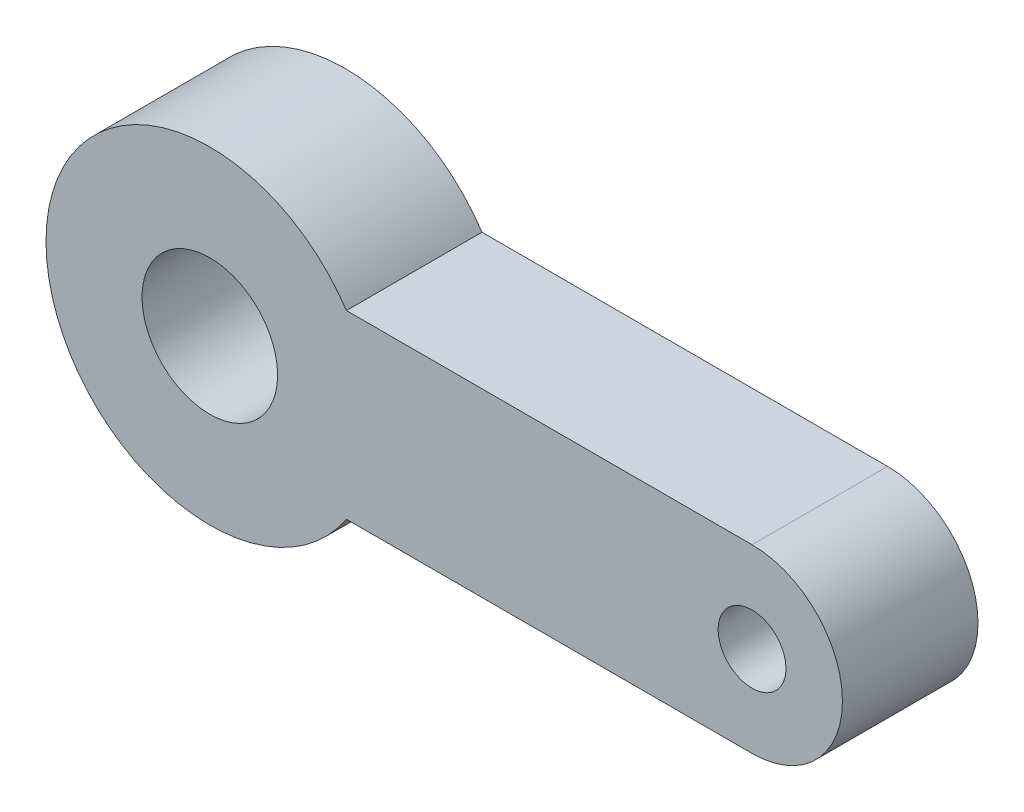
ISO-10303-21;
HEADER;
FILE_DESCRIPTION(('STEP AP214'),'2;1');
FILE_NAME('part.step','',(''),(''),'','','');
FILE_SCHEMA(('AUTOMOTIVE_DESIGN { 1 0 10303 214 1 1 1 1 }'));
ENDSEC;
DATA;
#1=APPLICATION_CONTEXT('core data for automotive mechanical design processes');
#2=APPLICATION_PROTOCOL_DEFINITION('international standard','automotive_design',2000,#1);
#3=PRODUCT_CONTEXT('',#1,'mechanical');
#4=PRODUCT('Part','Part','',(#3));
#5=PRODUCT_RELATED_PRODUCT_CATEGORY('part','',(#4));
#6=PRODUCT_DEFINITION_FORMATION('','',#4);
#7=PRODUCT_DEFINITION_CONTEXT('part definition',#1,'design');
#8=PRODUCT_DEFINITION('design','',#6,#7);
#9=PRODUCT_DEFINITION_SHAPE('','',#8);
#10=(LENGTH_UNIT() NAMED_UNIT(*) SI_UNIT(.MILLI.,.METRE.));
#11=(NAMED_UNIT(*) PLANE_ANGLE_UNIT() SI_UNIT($,.RADIAN.));
#12=(NAMED_UNIT(*) SI_UNIT($,.STERADIAN.) SOLID_ANGLE_UNIT());
#13=UNCERTAINTY_MEASURE_WITH_UNIT(LENGTH_MEASURE(1.E-05),#10,'distance_accuracy_value','');
#14=(GEOMETRIC_REPRESENTATION_CONTEXT(3) GLOBAL_UNCERTAINTY_ASSIGNED_CONTEXT((#13)) GLOBAL_UNIT_ASSIGNED_CONTEXT((#10,
#11,#12)) REPRESENTATION_CONTEXT('',''));
#15=CARTESIAN_POINT('',(0.,0.,0.));
#16=DIRECTION('',(0.,0.,1.));
#17=DIRECTION('',(1.,0.,0.));
#18=AXIS2_PLACEMENT_3D('',#15,#16,#17);
#19=CARTESIAN_POINT('',(-10.375,0.,6.));
#20=DIRECTION('',(0.,0.,-1.));
#21=DIRECTION('',(-1.,0.,0.));
#22=AXIS2_PLACEMENT_3D('',#19,#20,#21);
#23=CYLINDRICAL_SURFACE('',#22,7.25);
#24=CARTESIAN_POINT('',(-10.375,0.,0.));
#25=DIRECTION('',(0.,0.,1.));
#26=DIRECTION('',(1.,0.,0.));
#27=AXIS2_PLACEMENT_3D('',#24,#25,#26);
#28=CIRCLE('',#27,7.25);
#29=CARTESIAN_POINT('',(-4.32830668877608,4.,0.));
#30=VERTEX_POINT('',#29);
#31=CARTESIAN_POINT('',(-4.32830668877608,-4.,0.));
#32=VERTEX_POINT('',#31);
#33=EDGE_CURVE('E101',#30,#32,#28,.T.);
#34=ORIENTED_EDGE('',*,*,#33,.T.);
#35=DIRECTION('',(0.,0.,-1.));
#36=VECTOR('',#35,1.);
#37=CARTESIAN_POINT('',(-4.32830668877608,-4.,6.));
#38=LINE('',#37,#36);
#39=CARTESIAN_POINT('',(-4.32830668877608,-4.,6.));
#40=VERTEX_POINT('',#39);
#41=EDGE_CURVE('E11',#40,#32,#38,.T.);
#42=ORIENTED_EDGE('',*,*,#41,.F.);
#43=CARTESIAN_POINT('',(-10.375,0.,6.));
#44=DIRECTION('',(0.,0.,1.));
#45=DIRECTION('',(1.,0.,0.));
#46=AXIS2_PLACEMENT_3D('',#43,#44,#45);
#47=CIRCLE('',#46,7.25);
#48=CARTESIAN_POINT('',(-4.32830668877608,4.,6.));
#49=VERTEX_POINT('',#48);
#50=EDGE_CURVE('E89',#49,#40,#47,.T.);
#51=ORIENTED_EDGE('',*,*,#50,.F.);
#52=DIRECTION('',(0.,0.,-1.));
#53=VECTOR('',#52,1.);
#54=CARTESIAN_POINT('',(-4.32830668877608,4.,6.));
#55=LINE('',#54,#53);
#56=EDGE_CURVE('E97',#49,#30,#55,.T.);
#57=ORIENTED_EDGE('',*,*,#56,.T.);
#58=EDGE_LOOP('',(#34,#42,#51,#57));
#59=FACE_BOUND('',#58,.T.);
#60=ADVANCED_FACE('F38',(#59),#23,.T.);
#61=CARTESIAN_POINT('',(0.,-4.,6.));
#62=DIRECTION('',(0.,1.,0.));
#63=DIRECTION('',(-1.,0.,0.));
#64=AXIS2_PLACEMENT_3D('',#61,#62,#63);
#65=PLANE('',#64);
#66=DIRECTION('',(1.,0.,0.));
#67=VECTOR('',#66,1.);
#68=CARTESIAN_POINT('',(0.,-4.,0.));
#69=LINE('',#68,#67);
#70=CARTESIAN_POINT('',(13.625,-4.,0.));
#71=VERTEX_POINT('',#70);
#72=EDGE_CURVE('E93',#32,#71,#69,.T.);
#73=ORIENTED_EDGE('',*,*,#72,.T.);
#74=DIRECTION('',(0.,0.,-1.));
#75=VECTOR('',#74,1.);
#76=CARTESIAN_POINT('',(13.625,-4.,6.));
#77=LINE('',#76,#75);
#78=CARTESIAN_POINT('',(13.625,-4.,6.));
#79=VERTEX_POINT('',#78);
#80=EDGE_CURVE('E46',#79,#71,#77,.T.);
#81=ORIENTED_EDGE('',*,*,#80,.F.);
#82=DIRECTION('',(1.,0.,0.));
#83=VECTOR('',#82,1.);
#84=CARTESIAN_POINT('',(0.,-4.,6.));
#85=LINE('',#84,#83);
#86=EDGE_CURVE('E84',#40,#79,#85,.T.);
#87=ORIENTED_EDGE('',*,*,#86,.F.);
#88=ORIENTED_EDGE('',*,*,#41,.T.);
#89=EDGE_LOOP('',(#73,#81,#87,#88));
#90=FACE_BOUND('',#89,.T.);
#91=ADVANCED_FACE('F92',(#90),#65,.F.);
#92=CARTESIAN_POINT('',(13.625,0.,6.));
#93=DIRECTION('',(0.,0.,-1.));
#94=DIRECTION('',(-1.,0.,0.));
#95=AXIS2_PLACEMENT_3D('',#92,#93,#94);
#96=CYLINDRICAL_SURFACE('',#95,4.);
#97=CARTESIAN_POINT('',(13.625,0.,0.));
#98=DIRECTION('',(0.,0.,1.));
#99=DIRECTION('',(1.,0.,0.));
#100=AXIS2_PLACEMENT_3D('',#97,#98,#99);
#101=CIRCLE('',#100,4.);
#102=CARTESIAN_POINT('',(13.625,4.,0.));
#103=VERTEX_POINT('',#102);
#104=EDGE_CURVE('E71',#71,#103,#101,.T.);
#105=ORIENTED_EDGE('',*,*,#104,.T.);
#106=DIRECTION('',(0.,0.,-1.));
#107=VECTOR('',#106,1.);
#108=CARTESIAN_POINT('',(13.625,4.,6.));
#109=LINE('',#108,#107);
#110=CARTESIAN_POINT('',(13.625,4.,6.));
#111=VERTEX_POINT('',#110);
#112=EDGE_CURVE('E94',#111,#103,#109,.T.);
#113=ORIENTED_EDGE('',*,*,#112,.F.);
#114=CARTESIAN_POINT('',(13.625,0.,6.));
#115=DIRECTION('',(0.,0.,1.));
#116=DIRECTION('',(1.,0.,0.));
#117=AXIS2_PLACEMENT_3D('',#114,#115,#116);
#118=CIRCLE('',#117,4.);
#119=EDGE_CURVE('E87',#79,#111,#118,.T.);
#120=ORIENTED_EDGE('',*,*,#119,.F.);
#121=ORIENTED_EDGE('',*,*,#80,.T.);
#122=EDGE_LOOP('',(#105,#113,#120,#121));
#123=FACE_BOUND('',#122,.T.);
#124=ADVANCED_FACE('F95',(#123),#96,.T.);
#125=CARTESIAN_POINT('',(0.,4.,6.));
#126=DIRECTION('',(0.,-1.,0.));
#127=DIRECTION('',(0.,0.,-1.));
#128=AXIS2_PLACEMENT_3D('',#125,#126,#127);
#129=PLANE('',#128);
#130=DIRECTION('',(-1.,0.,0.));
#131=VECTOR('',#130,1.);
#132=CARTESIAN_POINT('',(0.,4.,0.));
#133=LINE('',#132,#131);
#134=EDGE_CURVE('E77',#103,#30,#133,.T.);
#135=ORIENTED_EDGE('',*,*,#134,.T.);
#136=ORIENTED_EDGE('',*,*,#56,.F.);
#137=DIRECTION('',(-1.,0.,0.));
#138=VECTOR('',#137,1.);
#139=CARTESIAN_POINT('',(0.,4.,6.));
#140=LINE('',#139,#138);
#141=EDGE_CURVE('E54',#111,#49,#140,.T.);
#142=ORIENTED_EDGE('',*,*,#141,.F.);
#143=ORIENTED_EDGE('',*,*,#112,.T.);
#144=EDGE_LOOP('',(#135,#136,#142,#143));
#145=FACE_BOUND('',#144,.T.);
#146=ADVANCED_FACE('F109',(#145),#129,.F.);
#147=CARTESIAN_POINT('',(0.,0.,6.));
#148=DIRECTION('',(0.,0.,1.));
#149=DIRECTION('',(1.,0.,0.));
#150=AXIS2_PLACEMENT_3D('',#147,#148,#149);
#151=PLANE('',#150);
#152=CARTESIAN_POINT('',(-10.3750000000052,0.,6.));
#153=DIRECTION('',(0.,0.,1.));
#154=DIRECTION('',(1.,0.,0.));
#155=AXIS2_PLACEMENT_3D('',#152,#153,#154);
#156=CIRCLE('',#155,3.);
#157=CARTESIAN_POINT('',(-7.37500000000524,0.,6.));
#158=VERTEX_POINT('',#157);
#159=EDGE_CURVE('E121',#158,#158,#156,.T.);
#160=ORIENTED_EDGE('',*,*,#159,.F.);
#161=EDGE_LOOP('',(#160));
#162=FACE_BOUND('',#161,.T.);
#163=CARTESIAN_POINT('',(13.625,0.,6.));
#164=DIRECTION('',(0.,0.,1.));
#165=DIRECTION('',(1.,0.,0.));
#166=AXIS2_PLACEMENT_3D('',#163,#164,#165);
#167=CIRCLE('',#166,1.5);
#168=CARTESIAN_POINT('',(15.125,0.,6.));
#169=VERTEX_POINT('',#168);
#170=EDGE_CURVE('E118',#169,#169,#167,.T.);
#171=ORIENTED_EDGE('',*,*,#170,.F.);
#172=EDGE_LOOP('',(#171));
#173=FACE_BOUND('',#172,.T.);
#174=ORIENTED_EDGE('',*,*,#50,.T.);
#175=ORIENTED_EDGE('',*,*,#86,.T.);
#176=ORIENTED_EDGE('',*,*,#119,.T.);
#177=ORIENTED_EDGE('',*,*,#141,.T.);
#178=EDGE_LOOP('',(#174,#175,#176,#177));
#179=FACE_BOUND('',#178,.T.);
#180=ADVANCED_FACE('F85',(#162,#173,#179),#151,.T.);
#181=CARTESIAN_POINT('',(0.,0.,0.));
#182=DIRECTION('',(0.,0.,1.));
#183=DIRECTION('',(1.,0.,0.));
#184=AXIS2_PLACEMENT_3D('',#181,#182,#183);
#185=PLANE('',#184);
#186=CARTESIAN_POINT('',(-10.3750000000052,0.,0.));
#187=DIRECTION('',(0.,0.,1.));
#188=DIRECTION('',(1.,0.,0.));
#189=AXIS2_PLACEMENT_3D('',#186,#187,#188);
#190=CIRCLE('',#189,3.);
#191=CARTESIAN_POINT('',(-7.37500000000524,0.,0.));
#192=VERTEX_POINT('',#191);
#193=EDGE_CURVE('E104',#192,#192,#190,.T.);
#194=ORIENTED_EDGE('',*,*,#193,.T.);
#195=EDGE_LOOP('',(#194));
#196=FACE_BOUND('',#195,.T.);
#197=CARTESIAN_POINT('',(13.625,0.,0.));
#198=DIRECTION('',(0.,0.,1.));
#199=DIRECTION('',(1.,0.,0.));
#200=AXIS2_PLACEMENT_3D('',#197,#198,#199);
#201=CIRCLE('',#200,1.5);
#202=CARTESIAN_POINT('',(15.125,0.,0.));
#203=VERTEX_POINT('',#202);
#204=EDGE_CURVE('E115',#203,#203,#201,.T.);
#205=ORIENTED_EDGE('',*,*,#204,.T.);
#206=EDGE_LOOP('',(#205));
#207=FACE_BOUND('',#206,.T.);
#208=ORIENTED_EDGE('',*,*,#33,.F.);
#209=ORIENTED_EDGE('',*,*,#134,.F.);
#210=ORIENTED_EDGE('',*,*,#104,.F.);
#211=ORIENTED_EDGE('',*,*,#72,.F.);
#212=EDGE_LOOP('',(#208,#209,#210,#211));
#213=FACE_BOUND('',#212,.T.);
#214=ADVANCED_FACE('F112',(#196,#207,#213),#185,.F.);
#215=CARTESIAN_POINT('',(13.625,0.,0.));
#216=DIRECTION('',(0.,0.,1.));
#217=DIRECTION('',(1.,0.,0.));
#218=AXIS2_PLACEMENT_3D('',#215,#216,#217);
#219=CYLINDRICAL_SURFACE('',#218,1.5);
#220=ORIENTED_EDGE('',*,*,#204,.F.);
#221=EDGE_LOOP('',(#220));
#222=FACE_BOUND('',#221,.T.);
#223=ORIENTED_EDGE('',*,*,#170,.T.);
#224=EDGE_LOOP('',(#223));
#225=FACE_BOUND('',#224,.T.);
#226=ADVANCED_FACE('F132',(#222,#225),#219,.F.);
#227=CARTESIAN_POINT('',(-10.3750000000052,0.,0.));
#228=DIRECTION('',(0.,0.,1.));
#229=DIRECTION('',(1.,0.,0.));
#230=AXIS2_PLACEMENT_3D('',#227,#228,#229);
#231=CYLINDRICAL_SURFACE('',#230,3.);
#232=ORIENTED_EDGE('',*,*,#193,.F.);
#233=EDGE_LOOP('',(#232));
#234=FACE_BOUND('',#233,.T.);
#235=ORIENTED_EDGE('',*,*,#159,.T.);
#236=EDGE_LOOP('',(#235));
#237=FACE_BOUND('',#236,.T.);
#238=ADVANCED_FACE('F129',(#234,#237),#231,.F.);
#239=CLOSED_SHELL('',(#60,#91,#124,#146,#180,#214,#226,#238));
#240=MANIFOLD_SOLID_BREP('B2',#239);
#241=ADVANCED_BREP_SHAPE_REPRESENTATION('',(#18,#240),#14);
#242=SHAPE_DEFINITION_REPRESENTATION(#9,#241);
ENDSEC;
END-ISO-10303-21;
